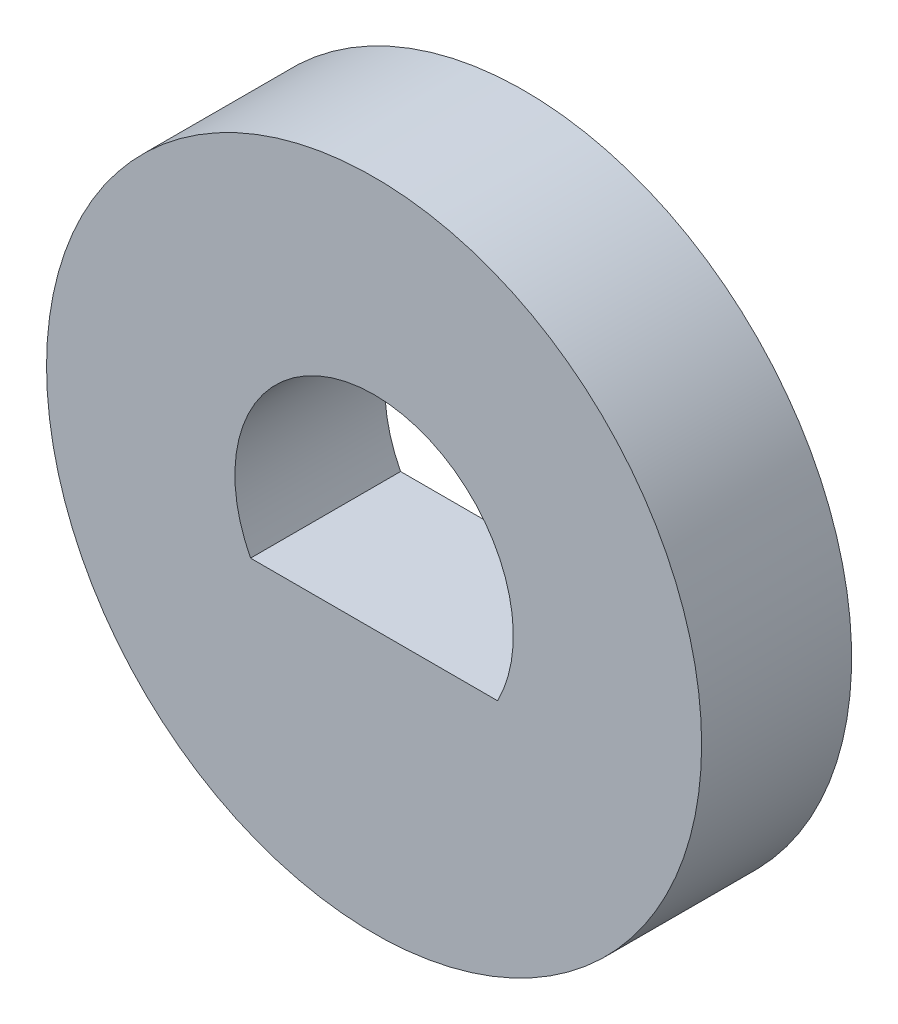
ISO-10303-21;
HEADER;
FILE_DESCRIPTION(('STEP AP214'),'2;1');
FILE_NAME('part.step','',(''),(''),'','','');
FILE_SCHEMA(('AUTOMOTIVE_DESIGN { 1 0 10303 214 1 1 1 1 }'));
ENDSEC;
DATA;
#1=APPLICATION_CONTEXT('core data for automotive mechanical design processes');
#2=APPLICATION_PROTOCOL_DEFINITION('international standard','automotive_design',2000,#1);
#3=PRODUCT_CONTEXT('',#1,'mechanical');
#4=PRODUCT('Part','Part','',(#3));
#5=PRODUCT_RELATED_PRODUCT_CATEGORY('part','',(#4));
#6=PRODUCT_DEFINITION_FORMATION('','',#4);
#7=PRODUCT_DEFINITION_CONTEXT('part definition',#1,'design');
#8=PRODUCT_DEFINITION('design','',#6,#7);
#9=PRODUCT_DEFINITION_SHAPE('','',#8);
#10=(LENGTH_UNIT() NAMED_UNIT(*) SI_UNIT(.MILLI.,.METRE.));
#11=(NAMED_UNIT(*) PLANE_ANGLE_UNIT() SI_UNIT($,.RADIAN.));
#12=(NAMED_UNIT(*) SI_UNIT($,.STERADIAN.) SOLID_ANGLE_UNIT());
#13=UNCERTAINTY_MEASURE_WITH_UNIT(LENGTH_MEASURE(1.E-05),#10,'distance_accuracy_value','');
#14=(GEOMETRIC_REPRESENTATION_CONTEXT(3) GLOBAL_UNCERTAINTY_ASSIGNED_CONTEXT((#13)) GLOBAL_UNIT_ASSIGNED_CONTEXT((#10,
#11,#12)) REPRESENTATION_CONTEXT('',''));
#15=CARTESIAN_POINT('',(0.,0.,0.));
#16=DIRECTION('',(0.,0.,1.));
#17=DIRECTION('',(1.,0.,0.));
#18=AXIS2_PLACEMENT_3D('',#15,#16,#17);
#19=CARTESIAN_POINT('',(0.,0.,-10.7509744826163));
#20=DIRECTION('',(0.,0.,-1.));
#21=DIRECTION('',(-1.,0.,0.));
#22=AXIS2_PLACEMENT_3D('',#19,#20,#21);
#23=CYLINDRICAL_SURFACE('',#22,4.99999999999989);
#24=CARTESIAN_POINT('',(0.,0.,-27.433110106347));
#25=DIRECTION('',(0.,0.,-1.));
#26=DIRECTION('',(-1.,0.,0.));
#27=AXIS2_PLACEMENT_3D('',#24,#25,#26);
#28=CIRCLE('',#27,4.99999999999989);
#29=CARTESIAN_POINT('',(-4.99999999999989,0.,-27.433110106347));
#30=VERTEX_POINT('',#29);
#31=EDGE_CURVE('E70',#30,#30,#28,.T.);
#32=ORIENTED_EDGE('',*,*,#31,.F.);
#33=EDGE_LOOP('',(#32));
#34=FACE_BOUND('',#33,.T.);
#35=CARTESIAN_POINT('',(0.,0.,-25.143110106347));
#36=DIRECTION('',(0.,0.,1.));
#37=DIRECTION('',(1.,0.,0.));
#38=AXIS2_PLACEMENT_3D('',#35,#36,#37);
#39=CIRCLE('',#38,4.99999999999989);
#40=CARTESIAN_POINT('',(4.99999999999989,0.,-25.143110106347));
#41=VERTEX_POINT('',#40);
#42=EDGE_CURVE('E66',#41,#41,#39,.F.);
#43=ORIENTED_EDGE('',*,*,#42,.T.);
#44=EDGE_LOOP('',(#43));
#45=FACE_BOUND('',#44,.T.);
#46=ADVANCED_FACE('F34',(#34,#45),#23,.T.);
#47=CARTESIAN_POINT('',(0.,0.,-10.7509744826163));
#48=DIRECTION('',(0.,0.,-1.));
#49=DIRECTION('',(-1.,0.,0.));
#50=AXIS2_PLACEMENT_3D('',#47,#48,#49);
#51=CYLINDRICAL_SURFACE('',#50,2.125);
#52=CARTESIAN_POINT('',(0.,0.,-25.143110106347));
#53=DIRECTION('',(0.,0.,1.));
#54=DIRECTION('',(1.,0.,0.));
#55=AXIS2_PLACEMENT_3D('',#52,#53,#54);
#56=CIRCLE('',#55,2.125);
#57=CARTESIAN_POINT('',(-1.88553042934873,-0.98,-25.143110106347));
#58=VERTEX_POINT('',#57);
#59=CARTESIAN_POINT('',(1.88553042934873,-0.98,-25.143110106347));
#60=VERTEX_POINT('',#59);
#61=EDGE_CURVE('E12',#58,#60,#56,.F.);
#62=ORIENTED_EDGE('',*,*,#61,.F.);
#63=DIRECTION('',(0.,0.,-1.));
#64=VECTOR('',#63,1.);
#65=CARTESIAN_POINT('',(-1.88553042934873,-0.98,-10.7509744826163));
#66=LINE('',#65,#64);
#67=CARTESIAN_POINT('',(-1.88553042934873,-0.98,-27.433110106347));
#68=VERTEX_POINT('',#67);
#69=EDGE_CURVE('E51',#58,#68,#66,.T.);
#70=ORIENTED_EDGE('',*,*,#69,.T.);
#71=CARTESIAN_POINT('',(0.,0.,-27.433110106347));
#72=DIRECTION('',(0.,0.,-1.));
#73=DIRECTION('',(-1.,0.,0.));
#74=AXIS2_PLACEMENT_3D('',#71,#72,#73);
#75=CIRCLE('',#74,2.125);
#76=CARTESIAN_POINT('',(1.88553042934873,-0.98,-27.433110106347));
#77=VERTEX_POINT('',#76);
#78=EDGE_CURVE('E63',#68,#77,#75,.T.);
#79=ORIENTED_EDGE('',*,*,#78,.T.);
#80=DIRECTION('',(0.,0.,-1.));
#81=VECTOR('',#80,1.);
#82=CARTESIAN_POINT('',(1.88553042934873,-0.98,-10.7509744826163));
#83=LINE('',#82,#81);
#84=EDGE_CURVE('E38',#60,#77,#83,.T.);
#85=ORIENTED_EDGE('',*,*,#84,.F.);
#86=EDGE_LOOP('',(#62,#70,#79,#85));
#87=FACE_BOUND('',#86,.T.);
#88=ADVANCED_FACE('F61',(#87),#51,.F.);
#89=CARTESIAN_POINT('',(1.88553042934873,-0.98,-10.7509744826163));
#90=DIRECTION('',(0.,-1.,0.));
#91=DIRECTION('',(0.,0.,-1.));
#92=AXIS2_PLACEMENT_3D('',#89,#90,#91);
#93=PLANE('',#92);
#94=DIRECTION('',(-1.,0.,0.));
#95=VECTOR('',#94,1.);
#96=CARTESIAN_POINT('',(1.88553042934873,-0.98,-25.143110106347));
#97=LINE('',#96,#95);
#98=EDGE_CURVE('E43',#60,#58,#97,.T.);
#99=ORIENTED_EDGE('',*,*,#98,.F.);
#100=ORIENTED_EDGE('',*,*,#84,.T.);
#101=DIRECTION('',(-1.,0.,0.));
#102=VECTOR('',#101,1.);
#103=CARTESIAN_POINT('',(1.88553042934873,-0.98,-27.433110106347));
#104=LINE('',#103,#102);
#105=EDGE_CURVE('E67',#77,#68,#104,.T.);
#106=ORIENTED_EDGE('',*,*,#105,.T.);
#107=ORIENTED_EDGE('',*,*,#69,.F.);
#108=EDGE_LOOP('',(#99,#100,#106,#107));
#109=FACE_BOUND('',#108,.T.);
#110=ADVANCED_FACE('F68',(#109),#93,.F.);
#111=CARTESIAN_POINT('',(0.,0.,-27.433110106347));
#112=DIRECTION('',(0.,0.,-1.));
#113=DIRECTION('',(-1.,0.,0.));
#114=AXIS2_PLACEMENT_3D('',#111,#112,#113);
#115=PLANE('',#114);
#116=ORIENTED_EDGE('',*,*,#78,.F.);
#117=ORIENTED_EDGE('',*,*,#105,.F.);
#118=EDGE_LOOP('',(#116,#117));
#119=FACE_BOUND('',#118,.T.);
#120=ORIENTED_EDGE('',*,*,#31,.T.);
#121=EDGE_LOOP('',(#120));
#122=FACE_BOUND('',#121,.T.);
#123=ADVANCED_FACE('F72',(#119,#122),#115,.T.);
#124=CARTESIAN_POINT('',(-2.,-0.73,-25.143110106347));
#125=DIRECTION('',(0.,0.,1.));
#126=DIRECTION('',(1.,0.,0.));
#127=AXIS2_PLACEMENT_3D('',#124,#125,#126);
#128=PLANE('',#127);
#129=ORIENTED_EDGE('',*,*,#42,.F.);
#130=EDGE_LOOP('',(#129));
#131=FACE_BOUND('',#130,.T.);
#132=ORIENTED_EDGE('',*,*,#98,.T.);
#133=ORIENTED_EDGE('',*,*,#61,.T.);
#134=EDGE_LOOP('',(#132,#133));
#135=FACE_BOUND('',#134,.T.);
#136=ADVANCED_FACE('F36',(#131,#135),#128,.T.);
#137=CLOSED_SHELL('',(#46,#88,#110,#123,#136));
#138=MANIFOLD_SOLID_BREP('B2',#137);
#139=ADVANCED_BREP_SHAPE_REPRESENTATION('',(#18,#138),#14);
#140=SHAPE_DEFINITION_REPRESENTATION(#9,#139);
ENDSEC;
END-ISO-10303-21;
